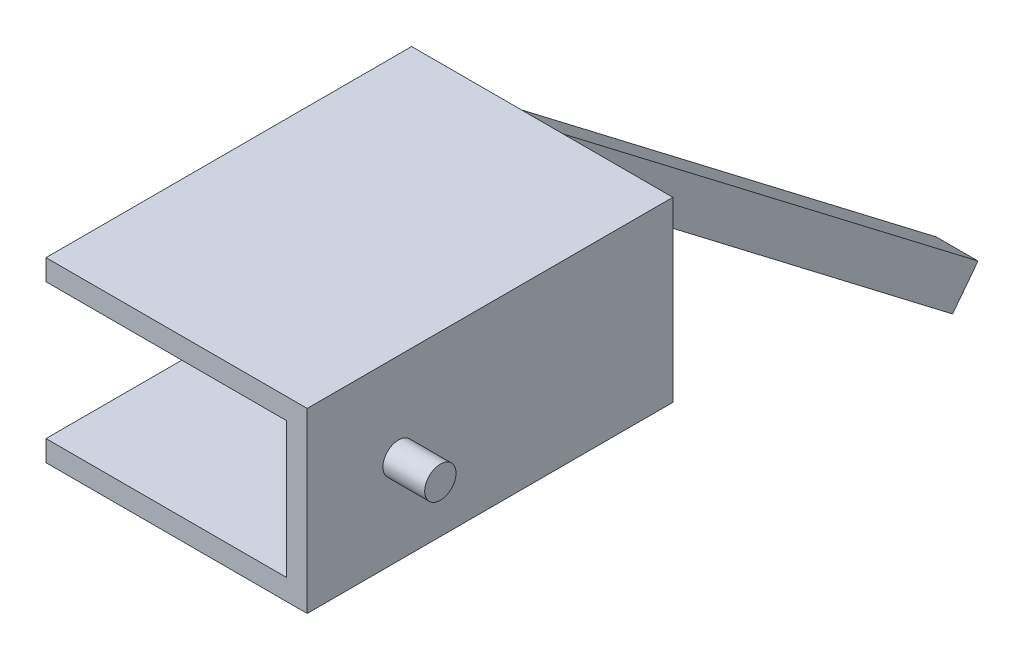
ISO-10303-21;
HEADER;
FILE_DESCRIPTION(('STEP AP214'),'2;1');
FILE_NAME('part.step','',(''),(''),'','','');
FILE_SCHEMA(('AUTOMOTIVE_DESIGN { 1 0 10303 214 1 1 1 1 }'));
ENDSEC;
DATA;
#1=APPLICATION_CONTEXT('core data for automotive mechanical design processes');
#2=APPLICATION_PROTOCOL_DEFINITION('international standard','automotive_design',2000,#1);
#3=PRODUCT_CONTEXT('',#1,'mechanical');
#4=PRODUCT('Part','Part','',(#3));
#5=PRODUCT_RELATED_PRODUCT_CATEGORY('part','',(#4));
#6=PRODUCT_DEFINITION_FORMATION('','',#4);
#7=PRODUCT_DEFINITION_CONTEXT('part definition',#1,'design');
#8=PRODUCT_DEFINITION('design','',#6,#7);
#9=PRODUCT_DEFINITION_SHAPE('','',#8);
#10=(LENGTH_UNIT() NAMED_UNIT(*) SI_UNIT(.MILLI.,.METRE.));
#11=(NAMED_UNIT(*) PLANE_ANGLE_UNIT() SI_UNIT($,.RADIAN.));
#12=(NAMED_UNIT(*) SI_UNIT($,.STERADIAN.) SOLID_ANGLE_UNIT());
#13=UNCERTAINTY_MEASURE_WITH_UNIT(LENGTH_MEASURE(1.E-05),#10,'distance_accuracy_value','');
#14=(GEOMETRIC_REPRESENTATION_CONTEXT(3) GLOBAL_UNCERTAINTY_ASSIGNED_CONTEXT((#13)) GLOBAL_UNIT_ASSIGNED_CONTEXT((#10,
#11,#12)) REPRESENTATION_CONTEXT('',''));
#15=CARTESIAN_POINT('',(0.,0.,0.));
#16=DIRECTION('',(0.,0.,1.));
#17=DIRECTION('',(1.,0.,0.));
#18=AXIS2_PLACEMENT_3D('',#15,#16,#17);
#19=CARTESIAN_POINT('',(0.,0.,0.));
#20=DIRECTION('',(0.,0.,1.));
#21=DIRECTION('',(1.,0.,0.));
#22=AXIS2_PLACEMENT_3D('',#19,#20,#21);
#23=PLANE('',#22);
#24=DIRECTION('',(0.,1.,0.));
#25=VECTOR('',#24,1.);
#26=CARTESIAN_POINT('',(-1.64150943396226,5.87839938306336,0.));
#27=LINE('',#26,#25);
#28=CARTESIAN_POINT('',(-1.64150943396226,5.87839938306336,0.));
#29=VERTEX_POINT('',#28);
#30=CARTESIAN_POINT('',(-1.64150943396226,10.9150943396226,0.));
#31=VERTEX_POINT('',#30);
#32=EDGE_CURVE('E167',#29,#31,#27,.T.);
#33=ORIENTED_EDGE('',*,*,#32,.F.);
#34=DIRECTION('',(-1.,0.,0.));
#35=VECTOR('',#34,1.);
#36=CARTESIAN_POINT('',(2.35849056603774,5.87839938306336,0.));
#37=LINE('',#36,#35);
#38=CARTESIAN_POINT('',(2.35849056603774,5.87839938306336,0.));
#39=VERTEX_POINT('',#38);
#40=EDGE_CURVE('E190',#39,#29,#37,.T.);
#41=ORIENTED_EDGE('',*,*,#40,.F.);
#42=DIRECTION('',(0.,1.,0.));
#43=VECTOR('',#42,1.);
#44=CARTESIAN_POINT('',(2.35849056603774,5.87839938306336,0.));
#45=LINE('',#44,#43);
#46=CARTESIAN_POINT('',(2.35849056603774,10.9150943396226,0.));
#47=VERTEX_POINT('',#46);
#48=EDGE_CURVE('E172',#39,#47,#45,.T.);
#49=ORIENTED_EDGE('',*,*,#48,.T.);
#50=DIRECTION('',(1.,0.,0.));
#51=VECTOR('',#50,1.);
#52=CARTESIAN_POINT('',(-12.1415094339623,10.9150943396226,0.));
#53=LINE('',#52,#51);
#54=CARTESIAN_POINT('',(12.8584905660377,10.9150943396226,0.));
#55=VERTEX_POINT('',#54);
#56=EDGE_CURVE('E216',#47,#55,#53,.T.);
#57=ORIENTED_EDGE('',*,*,#56,.T.);
#58=DIRECTION('',(0.,-1.,0.));
#59=VECTOR('',#58,1.);
#60=CARTESIAN_POINT('',(12.8584905660377,10.9150943396226,0.));
#61=LINE('',#60,#59);
#62=CARTESIAN_POINT('',(12.8584905660377,-6.08490566037736,0.));
#63=VERTEX_POINT('',#62);
#64=EDGE_CURVE('E213',#55,#63,#61,.T.);
#65=ORIENTED_EDGE('',*,*,#64,.T.);
#66=DIRECTION('',(1.,0.,0.));
#67=VECTOR('',#66,1.);
#68=CARTESIAN_POINT('',(-12.1415094339623,-6.08490566037736,0.));
#69=LINE('',#68,#67);
#70=CARTESIAN_POINT('',(-12.1415094339623,-6.08490566037736,0.));
#71=VERTEX_POINT('',#70);
#72=EDGE_CURVE('E210',#71,#63,#69,.T.);
#73=ORIENTED_EDGE('',*,*,#72,.F.);
#74=DIRECTION('',(0.,-1.,0.));
#75=VECTOR('',#74,1.);
#76=CARTESIAN_POINT('',(-12.1415094339623,10.9150943396226,0.));
#77=LINE('',#76,#75);
#78=CARTESIAN_POINT('',(-12.1415094339623,10.9150943396226,0.));
#79=VERTEX_POINT('',#78);
#80=EDGE_CURVE('E189',#79,#71,#77,.T.);
#81=ORIENTED_EDGE('',*,*,#80,.F.);
#82=EDGE_CURVE('E217',#79,#31,#53,.T.);
#83=ORIENTED_EDGE('',*,*,#82,.T.);
#84=EDGE_LOOP('',(#33,#41,#49,#57,#65,#73,#81,#83));
#85=FACE_BOUND('',#84,.T.);
#86=ADVANCED_FACE('F35',(#85),#23,.F.);
#87=CARTESIAN_POINT('',(-12.1415094339623,10.9150943396226,35.));
#88=DIRECTION('',(1.,0.,0.));
#89=DIRECTION('',(0.,1.,0.));
#90=AXIS2_PLACEMENT_3D('',#87,#88,#89);
#91=PLANE('',#90);
#92=DIRECTION('',(0.,-1.,0.));
#93=VECTOR('',#92,1.);
#94=CARTESIAN_POINT('',(-12.1415094339623,10.9150943396226,35.));
#95=LINE('',#94,#93);
#96=CARTESIAN_POINT('',(-12.1415094339623,-4.08490566037736,35.));
#97=VERTEX_POINT('',#96);
#98=CARTESIAN_POINT('',(-12.1415094339623,-6.08490566037736,35.));
#99=VERTEX_POINT('',#98);
#100=EDGE_CURVE('E199',#97,#99,#95,.T.);
#101=ORIENTED_EDGE('',*,*,#100,.F.);
#102=DIRECTION('',(0.,0.,1.));
#103=VECTOR('',#102,1.);
#104=CARTESIAN_POINT('',(-12.1415094339623,-4.08490566037736,4.));
#105=LINE('',#104,#103);
#106=CARTESIAN_POINT('',(-12.1415094339623,-4.08490566037736,4.));
#107=VERTEX_POINT('',#106);
#108=EDGE_CURVE('E162',#107,#97,#105,.T.);
#109=ORIENTED_EDGE('',*,*,#108,.F.);
#110=DIRECTION('',(0.,-1.,0.));
#111=VECTOR('',#110,1.);
#112=CARTESIAN_POINT('',(-12.1415094339623,8.91509433962264,4.));
#113=LINE('',#112,#111);
#114=CARTESIAN_POINT('',(-12.1415094339623,8.91509433962264,4.));
#115=VERTEX_POINT('',#114);
#116=EDGE_CURVE('E141',#115,#107,#113,.T.);
#117=ORIENTED_EDGE('',*,*,#116,.F.);
#118=DIRECTION('',(0.,0.,1.));
#119=VECTOR('',#118,1.);
#120=CARTESIAN_POINT('',(-12.1415094339623,8.91509433962264,4.));
#121=LINE('',#120,#119);
#122=CARTESIAN_POINT('',(-12.1415094339623,8.91509433962264,35.));
#123=VERTEX_POINT('',#122);
#124=EDGE_CURVE('E132',#115,#123,#121,.T.);
#125=ORIENTED_EDGE('',*,*,#124,.T.);
#126=CARTESIAN_POINT('',(-12.1415094339623,10.9150943396226,35.));
#127=VERTEX_POINT('',#126);
#128=EDGE_CURVE('E195',#127,#123,#95,.T.);
#129=ORIENTED_EDGE('',*,*,#128,.F.);
#130=DIRECTION('',(0.,0.,-1.));
#131=VECTOR('',#130,1.);
#132=CARTESIAN_POINT('',(-12.1415094339623,10.9150943396226,35.));
#133=LINE('',#132,#131);
#134=EDGE_CURVE('E207',#127,#79,#133,.T.);
#135=ORIENTED_EDGE('',*,*,#134,.T.);
#136=ORIENTED_EDGE('',*,*,#80,.T.);
#137=DIRECTION('',(0.,0.,-1.));
#138=VECTOR('',#137,1.);
#139=CARTESIAN_POINT('',(-12.1415094339623,-6.08490566037736,35.));
#140=LINE('',#139,#138);
#141=EDGE_CURVE('E11',#99,#71,#140,.T.);
#142=ORIENTED_EDGE('',*,*,#141,.F.);
#143=EDGE_LOOP('',(#101,#109,#117,#125,#129,#135,#136,#142));
#144=FACE_BOUND('',#143,.T.);
#145=ADVANCED_FACE('F37',(#144),#91,.F.);
#146=CARTESIAN_POINT('',(-12.1415094339623,-6.08490566037736,35.));
#147=DIRECTION('',(0.,1.,0.));
#148=DIRECTION('',(0.,0.,1.));
#149=AXIS2_PLACEMENT_3D('',#146,#147,#148);
#150=PLANE('',#149);
#151=ORIENTED_EDGE('',*,*,#72,.T.);
#152=DIRECTION('',(0.,0.,-1.));
#153=VECTOR('',#152,1.);
#154=CARTESIAN_POINT('',(12.8584905660377,-6.08490566037736,35.));
#155=LINE('',#154,#153);
#156=CARTESIAN_POINT('',(12.8584905660377,-6.08490566037736,35.));
#157=VERTEX_POINT('',#156);
#158=EDGE_CURVE('E43',#157,#63,#155,.T.);
#159=ORIENTED_EDGE('',*,*,#158,.F.);
#160=DIRECTION('',(1.,0.,0.));
#161=VECTOR('',#160,1.);
#162=CARTESIAN_POINT('',(-12.1415094339623,-6.08490566037736,35.));
#163=LINE('',#162,#161);
#164=EDGE_CURVE('E198',#99,#157,#163,.T.);
#165=ORIENTED_EDGE('',*,*,#164,.F.);
#166=ORIENTED_EDGE('',*,*,#141,.T.);
#167=EDGE_LOOP('',(#151,#159,#165,#166));
#168=FACE_BOUND('',#167,.T.);
#169=ADVANCED_FACE('F230',(#168),#150,.F.);
#170=CARTESIAN_POINT('',(12.8584905660377,10.9150943396226,35.));
#171=DIRECTION('',(1.,0.,0.));
#172=DIRECTION('',(0.,1.,0.));
#173=AXIS2_PLACEMENT_3D('',#170,#171,#172);
#174=PLANE('',#173);
#175=CARTESIAN_POINT('',(12.8584905660377,2.42656212208795,26.251622055576));
#176=DIRECTION('',(1.,0.,0.));
#177=DIRECTION('',(0.,1.,0.));
#178=AXIS2_PLACEMENT_3D('',#175,#176,#177);
#179=CIRCLE('',#178,1.5);
#180=CARTESIAN_POINT('',(12.8584905660377,3.92656212208795,26.251622055576));
#181=VERTEX_POINT('',#180);
#182=EDGE_CURVE('E151',#181,#181,#179,.T.);
#183=ORIENTED_EDGE('',*,*,#182,.F.);
#184=EDGE_LOOP('',(#183));
#185=FACE_BOUND('',#184,.T.);
#186=ORIENTED_EDGE('',*,*,#64,.F.);
#187=DIRECTION('',(0.,0.,-1.));
#188=VECTOR('',#187,1.);
#189=CARTESIAN_POINT('',(12.8584905660377,10.9150943396226,35.));
#190=LINE('',#189,#188);
#191=CARTESIAN_POINT('',(12.8584905660377,10.9150943396226,35.));
#192=VERTEX_POINT('',#191);
#193=EDGE_CURVE('E221',#192,#55,#190,.T.);
#194=ORIENTED_EDGE('',*,*,#193,.F.);
#195=DIRECTION('',(0.,-1.,0.));
#196=VECTOR('',#195,1.);
#197=CARTESIAN_POINT('',(12.8584905660377,10.9150943396226,35.));
#198=LINE('',#197,#196);
#199=EDGE_CURVE('E201',#192,#157,#198,.T.);
#200=ORIENTED_EDGE('',*,*,#199,.T.);
#201=ORIENTED_EDGE('',*,*,#158,.T.);
#202=EDGE_LOOP('',(#186,#194,#200,#201));
#203=FACE_BOUND('',#202,.T.);
#204=ADVANCED_FACE('F226',(#185,#203),#174,.T.);
#205=CARTESIAN_POINT('',(-12.1415094339623,10.9150943396226,35.));
#206=DIRECTION('',(0.,1.,0.));
#207=DIRECTION('',(0.,0.,1.));
#208=AXIS2_PLACEMENT_3D('',#205,#206,#207);
#209=PLANE('',#208);
#210=ORIENTED_EDGE('',*,*,#82,.F.);
#211=ORIENTED_EDGE('',*,*,#134,.F.);
#212=DIRECTION('',(1.,0.,0.));
#213=VECTOR('',#212,1.);
#214=CARTESIAN_POINT('',(-12.1415094339623,10.9150943396226,35.));
#215=LINE('',#214,#213);
#216=EDGE_CURVE('E204',#127,#192,#215,.T.);
#217=ORIENTED_EDGE('',*,*,#216,.T.);
#218=ORIENTED_EDGE('',*,*,#193,.T.);
#219=ORIENTED_EDGE('',*,*,#56,.F.);
#220=DIRECTION('',(-1.,0.,0.));
#221=VECTOR('',#220,1.);
#222=CARTESIAN_POINT('',(2.35849056603774,10.9150943396226,0.));
#223=LINE('',#222,#221);
#224=EDGE_CURVE('E186',#47,#31,#223,.T.);
#225=ORIENTED_EDGE('',*,*,#224,.T.);
#226=EDGE_LOOP('',(#210,#211,#217,#218,#219,#225));
#227=FACE_BOUND('',#226,.T.);
#228=ADVANCED_FACE('F239',(#227),#209,.T.);
#229=CARTESIAN_POINT('',(0.,0.,35.));
#230=DIRECTION('',(0.,0.,1.));
#231=DIRECTION('',(1.,0.,0.));
#232=AXIS2_PLACEMENT_3D('',#229,#230,#231);
#233=PLANE('',#232);
#234=DIRECTION('',(1.,0.,0.));
#235=VECTOR('',#234,1.);
#236=CARTESIAN_POINT('',(10.8584905660377,-4.08490566037736,35.));
#237=LINE('',#236,#235);
#238=CARTESIAN_POINT('',(10.8584905660377,-4.08490566037736,35.));
#239=VERTEX_POINT('',#238);
#240=EDGE_CURVE('E145',#97,#239,#237,.T.);
#241=ORIENTED_EDGE('',*,*,#240,.F.);
#242=ORIENTED_EDGE('',*,*,#100,.T.);
#243=ORIENTED_EDGE('',*,*,#164,.T.);
#244=ORIENTED_EDGE('',*,*,#199,.F.);
#245=ORIENTED_EDGE('',*,*,#216,.F.);
#246=ORIENTED_EDGE('',*,*,#128,.T.);
#247=DIRECTION('',(-1.,0.,0.));
#248=VECTOR('',#247,1.);
#249=CARTESIAN_POINT('',(10.8584905660377,8.91509433962264,35.));
#250=LINE('',#249,#248);
#251=CARTESIAN_POINT('',(10.8584905660377,8.91509433962264,35.));
#252=VERTEX_POINT('',#251);
#253=EDGE_CURVE('E148',#252,#123,#250,.T.);
#254=ORIENTED_EDGE('',*,*,#253,.F.);
#255=DIRECTION('',(0.,1.,0.));
#256=VECTOR('',#255,1.);
#257=CARTESIAN_POINT('',(10.8584905660377,8.91509433962264,35.));
#258=LINE('',#257,#256);
#259=EDGE_CURVE('E50',#239,#252,#258,.T.);
#260=ORIENTED_EDGE('',*,*,#259,.F.);
#261=EDGE_LOOP('',(#241,#242,#243,#244,#245,#246,#254,#260));
#262=FACE_BOUND('',#261,.T.);
#263=ADVANCED_FACE('F243',(#262),#233,.T.);
#264=CARTESIAN_POINT('',(2.35849056603774,10.9150943396226,0.));
#265=DIRECTION('',(0.,0.794171581662059,-0.607693589632458));
#266=DIRECTION('',(0.,0.607693589632458,0.79417158166206));
#267=AXIS2_PLACEMENT_3D('',#264,#265,#266);
#268=PLANE('',#267);
#269=DIRECTION('',(0.,-0.607693589632458,-0.79417158166206));
#270=VECTOR('',#269,1.);
#271=CARTESIAN_POINT('',(-1.64150943396226,10.9150943396226,0.));
#272=LINE('',#271,#270);
#273=CARTESIAN_POINT('',(-1.64150943396226,-19.4695851420003,-39.708579083103));
#274=VERTEX_POINT('',#273);
#275=EDGE_CURVE('E161',#31,#274,#272,.T.);
#276=ORIENTED_EDGE('',*,*,#275,.F.);
#277=ORIENTED_EDGE('',*,*,#224,.F.);
#278=DIRECTION('',(0.,-0.607693589632458,-0.79417158166206));
#279=VECTOR('',#278,1.);
#280=CARTESIAN_POINT('',(2.35849056603774,10.9150943396226,0.));
#281=LINE('',#280,#279);
#282=CARTESIAN_POINT('',(2.35849056603774,-19.4695851420003,-39.708579083103));
#283=VERTEX_POINT('',#282);
#284=EDGE_CURVE('E58',#47,#283,#281,.T.);
#285=ORIENTED_EDGE('',*,*,#284,.T.);
#286=DIRECTION('',(-1.,0.,0.));
#287=VECTOR('',#286,1.);
#288=CARTESIAN_POINT('',(2.35849056603774,-19.4695851420003,-39.708579083103));
#289=LINE('',#288,#287);
#290=EDGE_CURVE('E175',#283,#274,#289,.T.);
#291=ORIENTED_EDGE('',*,*,#290,.T.);
#292=EDGE_LOOP('',(#276,#277,#285,#291));
#293=FACE_BOUND('',#292,.T.);
#294=ADVANCED_FACE('F249',(#293),#268,.T.);
#295=CARTESIAN_POINT('',(2.35849056603774,-22.6462714686485,-37.2778047245732));
#296=DIRECTION('',(0.,-0.79417158166206,0.607693589632458));
#297=DIRECTION('',(0.,-0.607693589632458,-0.79417158166206));
#298=AXIS2_PLACEMENT_3D('',#295,#296,#297);
#299=PLANE('',#298);
#300=DIRECTION('',(0.,0.607693589632458,0.79417158166206));
#301=VECTOR('',#300,1.);
#302=CARTESIAN_POINT('',(-1.64150943396226,-22.6462714686485,-37.2778047245732));
#303=LINE('',#302,#301);
#304=CARTESIAN_POINT('',(-1.64150943396226,-22.6462714686485,-37.2778047245732));
#305=VERTEX_POINT('',#304);
#306=EDGE_CURVE('E181',#305,#29,#303,.T.);
#307=ORIENTED_EDGE('',*,*,#306,.F.);
#308=DIRECTION('',(-1.,0.,0.));
#309=VECTOR('',#308,1.);
#310=CARTESIAN_POINT('',(2.35849056603774,-22.6462714686485,-37.2778047245732));
#311=LINE('',#310,#309);
#312=CARTESIAN_POINT('',(2.35849056603774,-22.6462714686485,-37.2778047245732));
#313=VERTEX_POINT('',#312);
#314=EDGE_CURVE('E192',#313,#305,#311,.T.);
#315=ORIENTED_EDGE('',*,*,#314,.F.);
#316=DIRECTION('',(0.,0.607693589632458,0.79417158166206));
#317=VECTOR('',#316,1.);
#318=CARTESIAN_POINT('',(2.35849056603774,-22.6462714686485,-37.2778047245732));
#319=LINE('',#318,#317);
#320=EDGE_CURVE('E170',#313,#39,#319,.T.);
#321=ORIENTED_EDGE('',*,*,#320,.T.);
#322=ORIENTED_EDGE('',*,*,#40,.T.);
#323=EDGE_LOOP('',(#307,#315,#321,#322));
#324=FACE_BOUND('',#323,.T.);
#325=ADVANCED_FACE('F255',(#324),#299,.T.);
#326=CARTESIAN_POINT('',(2.35849056603774,-19.4695851420003,-39.708579083103));
#327=DIRECTION('',(0.,-0.607693589632457,-0.794171581662061));
#328=DIRECTION('',(0.,0.794171581662061,-0.607693589632457));
#329=AXIS2_PLACEMENT_3D('',#326,#327,#328);
#330=PLANE('',#329);
#331=DIRECTION('',(0.,-0.794171581662061,0.607693589632457));
#332=VECTOR('',#331,1.);
#333=CARTESIAN_POINT('',(-1.64150943396226,-19.4695851420003,-39.708579083103));
#334=LINE('',#333,#332);
#335=EDGE_CURVE('E178',#274,#305,#334,.T.);
#336=ORIENTED_EDGE('',*,*,#335,.F.);
#337=ORIENTED_EDGE('',*,*,#290,.F.);
#338=DIRECTION('',(0.,-0.794171581662061,0.607693589632457));
#339=VECTOR('',#338,1.);
#340=CARTESIAN_POINT('',(2.35849056603774,-19.4695851420003,-39.708579083103));
#341=LINE('',#340,#339);
#342=EDGE_CURVE('E166',#283,#313,#341,.T.);
#343=ORIENTED_EDGE('',*,*,#342,.T.);
#344=ORIENTED_EDGE('',*,*,#314,.T.);
#345=EDGE_LOOP('',(#336,#337,#343,#344));
#346=FACE_BOUND('',#345,.T.);
#347=ADVANCED_FACE('F259',(#346),#330,.T.);
#348=CARTESIAN_POINT('',(2.35849056603774,0.,0.));
#349=DIRECTION('',(-1.,0.,0.));
#350=DIRECTION('',(0.,-1.,0.));
#351=AXIS2_PLACEMENT_3D('',#348,#349,#350);
#352=PLANE('',#351);
#353=ORIENTED_EDGE('',*,*,#284,.F.);
#354=ORIENTED_EDGE('',*,*,#48,.F.);
#355=ORIENTED_EDGE('',*,*,#320,.F.);
#356=ORIENTED_EDGE('',*,*,#342,.F.);
#357=EDGE_LOOP('',(#353,#354,#355,#356));
#358=FACE_BOUND('',#357,.T.);
#359=ADVANCED_FACE('F257',(#358),#352,.F.);
#360=CARTESIAN_POINT('',(-1.64150943396226,0.,0.));
#361=DIRECTION('',(-1.,0.,0.));
#362=DIRECTION('',(0.,-1.,0.));
#363=AXIS2_PLACEMENT_3D('',#360,#361,#362);
#364=PLANE('',#363);
#365=ORIENTED_EDGE('',*,*,#275,.T.);
#366=ORIENTED_EDGE('',*,*,#335,.T.);
#367=ORIENTED_EDGE('',*,*,#306,.T.);
#368=ORIENTED_EDGE('',*,*,#32,.T.);
#369=EDGE_LOOP('',(#365,#366,#367,#368));
#370=FACE_BOUND('',#369,.T.);
#371=ADVANCED_FACE('F252',(#370),#364,.T.);
#372=CARTESIAN_POINT('',(10.8584905660377,8.91509433962264,4.));
#373=DIRECTION('',(1.,0.,0.));
#374=DIRECTION('',(0.,1.,0.));
#375=AXIS2_PLACEMENT_3D('',#372,#373,#374);
#376=PLANE('',#375);
#377=ORIENTED_EDGE('',*,*,#259,.T.);
#378=DIRECTION('',(0.,0.,1.));
#379=VECTOR('',#378,1.);
#380=CARTESIAN_POINT('',(10.8584905660377,8.91509433962264,4.));
#381=LINE('',#380,#379);
#382=CARTESIAN_POINT('',(10.8584905660377,8.91509433962264,4.));
#383=VERTEX_POINT('',#382);
#384=EDGE_CURVE('E124',#383,#252,#381,.T.);
#385=ORIENTED_EDGE('',*,*,#384,.F.);
#386=DIRECTION('',(0.,1.,0.));
#387=VECTOR('',#386,1.);
#388=CARTESIAN_POINT('',(10.8584905660377,8.91509433962264,4.));
#389=LINE('',#388,#387);
#390=CARTESIAN_POINT('',(10.8584905660377,-4.08490566037736,4.));
#391=VERTEX_POINT('',#390);
#392=EDGE_CURVE('E128',#391,#383,#389,.T.);
#393=ORIENTED_EDGE('',*,*,#392,.F.);
#394=DIRECTION('',(0.,0.,1.));
#395=VECTOR('',#394,1.);
#396=CARTESIAN_POINT('',(10.8584905660377,-4.08490566037736,4.));
#397=LINE('',#396,#395);
#398=EDGE_CURVE('E159',#391,#239,#397,.T.);
#399=ORIENTED_EDGE('',*,*,#398,.T.);
#400=EDGE_LOOP('',(#377,#385,#393,#399));
#401=FACE_BOUND('',#400,.T.);
#402=ADVANCED_FACE('F126',(#401),#376,.F.);
#403=CARTESIAN_POINT('',(10.8584905660377,-4.08490566037736,4.));
#404=DIRECTION('',(0.,-1.,0.));
#405=DIRECTION('',(1.,0.,0.));
#406=AXIS2_PLACEMENT_3D('',#403,#404,#405);
#407=PLANE('',#406);
#408=ORIENTED_EDGE('',*,*,#240,.T.);
#409=ORIENTED_EDGE('',*,*,#398,.F.);
#410=DIRECTION('',(1.,0.,0.));
#411=VECTOR('',#410,1.);
#412=CARTESIAN_POINT('',(10.8584905660377,-4.08490566037736,4.));
#413=LINE('',#412,#411);
#414=EDGE_CURVE('E133',#107,#391,#413,.T.);
#415=ORIENTED_EDGE('',*,*,#414,.F.);
#416=ORIENTED_EDGE('',*,*,#108,.T.);
#417=EDGE_LOOP('',(#408,#409,#415,#416));
#418=FACE_BOUND('',#417,.T.);
#419=ADVANCED_FACE('F355',(#418),#407,.F.);
#420=CARTESIAN_POINT('',(10.8584905660377,8.91509433962264,4.));
#421=DIRECTION('',(0.,1.,0.));
#422=DIRECTION('',(-1.,0.,0.));
#423=AXIS2_PLACEMENT_3D('',#420,#421,#422);
#424=PLANE('',#423);
#425=ORIENTED_EDGE('',*,*,#253,.T.);
#426=ORIENTED_EDGE('',*,*,#124,.F.);
#427=DIRECTION('',(-1.,0.,0.));
#428=VECTOR('',#427,1.);
#429=CARTESIAN_POINT('',(10.8584905660377,8.91509433962264,4.));
#430=LINE('',#429,#428);
#431=EDGE_CURVE('E136',#383,#115,#430,.T.);
#432=ORIENTED_EDGE('',*,*,#431,.F.);
#433=ORIENTED_EDGE('',*,*,#384,.T.);
#434=EDGE_LOOP('',(#425,#426,#432,#433));
#435=FACE_BOUND('',#434,.T.);
#436=ADVANCED_FACE('F137',(#435),#424,.F.);
#437=CARTESIAN_POINT('',(0.,0.,4.));
#438=DIRECTION('',(0.,0.,-1.));
#439=DIRECTION('',(-1.,0.,0.));
#440=AXIS2_PLACEMENT_3D('',#437,#438,#439);
#441=PLANE('',#440);
#442=ORIENTED_EDGE('',*,*,#392,.T.);
#443=ORIENTED_EDGE('',*,*,#431,.T.);
#444=ORIENTED_EDGE('',*,*,#116,.T.);
#445=ORIENTED_EDGE('',*,*,#414,.T.);
#446=EDGE_LOOP('',(#442,#443,#444,#445));
#447=FACE_BOUND('',#446,.T.);
#448=ADVANCED_FACE('F143',(#447),#441,.F.);
#449=CARTESIAN_POINT('',(16.8584905660377,2.42656212208795,26.251622055576));
#450=DIRECTION('',(-1.,0.,0.));
#451=DIRECTION('',(0.,-1.,0.));
#452=AXIS2_PLACEMENT_3D('',#449,#450,#451);
#453=CYLINDRICAL_SURFACE('',#452,1.5);
#454=CARTESIAN_POINT('',(16.8584905660377,2.42656212208795,26.251622055576));
#455=DIRECTION('',(1.,0.,0.));
#456=DIRECTION('',(0.,1.,0.));
#457=AXIS2_PLACEMENT_3D('',#454,#455,#456);
#458=CIRCLE('',#457,1.5);
#459=CARTESIAN_POINT('',(16.8584905660377,3.92656212208795,26.251622055576));
#460=VERTEX_POINT('',#459);
#461=EDGE_CURVE('E157',#460,#460,#458,.T.);
#462=ORIENTED_EDGE('',*,*,#461,.F.);
#463=EDGE_LOOP('',(#462));
#464=FACE_BOUND('',#463,.T.);
#465=ORIENTED_EDGE('',*,*,#182,.T.);
#466=EDGE_LOOP('',(#465));
#467=FACE_BOUND('',#466,.T.);
#468=ADVANCED_FACE('F372',(#464,#467),#453,.T.);
#469=CARTESIAN_POINT('',(16.8584905660377,2.42656212208795,26.251622055576));
#470=DIRECTION('',(1.,0.,0.));
#471=DIRECTION('',(0.,1.,0.));
#472=AXIS2_PLACEMENT_3D('',#469,#470,#471);
#473=PLANE('',#472);
#474=ORIENTED_EDGE('',*,*,#461,.T.);
#475=EDGE_LOOP('',(#474));
#476=FACE_BOUND('',#475,.T.);
#477=ADVANCED_FACE('F378',(#476),#473,.T.);
#478=CLOSED_SHELL('',(#86,#145,#169,#204,#228,#263,#294,#325,#347,#359,#371,#402,#419,#436,#448,
#468,#477));
#479=MANIFOLD_SOLID_BREP('B2',#478);
#480=ADVANCED_BREP_SHAPE_REPRESENTATION('',(#18,#479),#14);
#481=SHAPE_DEFINITION_REPRESENTATION(#9,#480);
ENDSEC;
END-ISO-10303-21;
